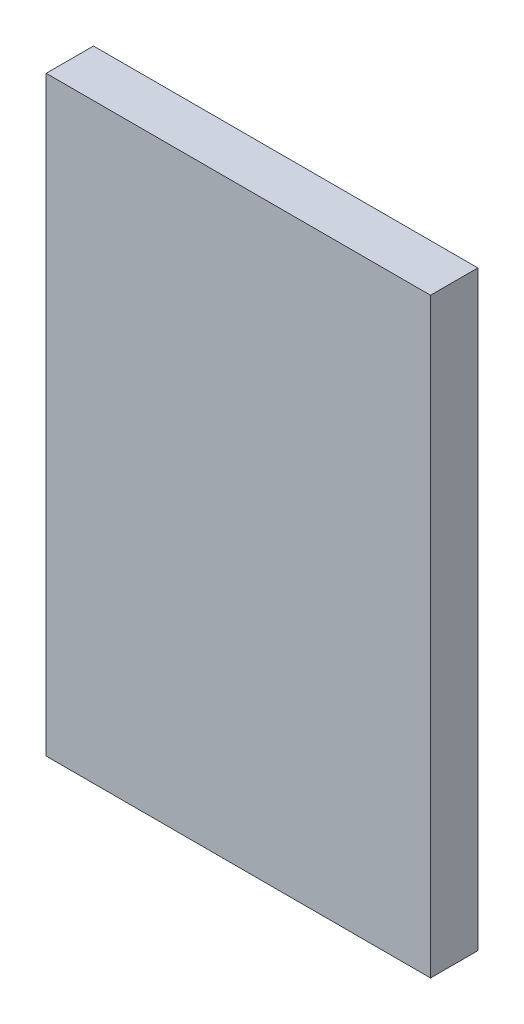
ISO-10303-21;
HEADER;
FILE_DESCRIPTION(('STEP AP214'),'2;1');
FILE_NAME('part.step','',(''),(''),'','','');
FILE_SCHEMA(('AUTOMOTIVE_DESIGN { 1 0 10303 214 1 1 1 1 }'));
ENDSEC;
DATA;
#1=APPLICATION_CONTEXT('core data for automotive mechanical design processes');
#2=APPLICATION_PROTOCOL_DEFINITION('international standard','automotive_design',2000,#1);
#3=PRODUCT_CONTEXT('',#1,'mechanical');
#4=PRODUCT('Part','Part','',(#3));
#5=PRODUCT_RELATED_PRODUCT_CATEGORY('part','',(#4));
#6=PRODUCT_DEFINITION_FORMATION('','',#4);
#7=PRODUCT_DEFINITION_CONTEXT('part definition',#1,'design');
#8=PRODUCT_DEFINITION('design','',#6,#7);
#9=PRODUCT_DEFINITION_SHAPE('','',#8);
#10=(LENGTH_UNIT() NAMED_UNIT(*) SI_UNIT(.MILLI.,.METRE.));
#11=(NAMED_UNIT(*) PLANE_ANGLE_UNIT() SI_UNIT($,.RADIAN.));
#12=(NAMED_UNIT(*) SI_UNIT($,.STERADIAN.) SOLID_ANGLE_UNIT());
#13=UNCERTAINTY_MEASURE_WITH_UNIT(LENGTH_MEASURE(1.E-05),#10,'distance_accuracy_value','');
#14=(GEOMETRIC_REPRESENTATION_CONTEXT(3) GLOBAL_UNCERTAINTY_ASSIGNED_CONTEXT((#13)) GLOBAL_UNIT_ASSIGNED_CONTEXT((#10,
#11,#12)) REPRESENTATION_CONTEXT('',''));
#15=CARTESIAN_POINT('',(0.,0.,0.));
#16=DIRECTION('',(0.,0.,1.));
#17=DIRECTION('',(1.,0.,0.));
#18=AXIS2_PLACEMENT_3D('',#15,#16,#17);
#19=CARTESIAN_POINT('',(0.,0.,-8.));
#20=DIRECTION('',(0.,-1.,0.));
#21=DIRECTION('',(0.,0.,-1.));
#22=AXIS2_PLACEMENT_3D('',#19,#20,#21);
#23=PLANE('',#22);
#24=DIRECTION('',(1.,0.,0.));
#25=VECTOR('',#24,1.);
#26=CARTESIAN_POINT('',(0.,0.,0.));
#27=LINE('',#26,#25);
#28=CARTESIAN_POINT('',(0.,0.,0.));
#29=VERTEX_POINT('',#28);
#30=CARTESIAN_POINT('',(65.,0.,0.));
#31=VERTEX_POINT('',#30);
#32=EDGE_CURVE('E100',#29,#31,#27,.T.);
#33=ORIENTED_EDGE('',*,*,#32,.F.);
#34=DIRECTION('',(0.,0.,1.));
#35=VECTOR('',#34,1.);
#36=CARTESIAN_POINT('',(0.,0.,-8.));
#37=LINE('',#36,#35);
#38=CARTESIAN_POINT('',(0.,0.,-8.));
#39=VERTEX_POINT('',#38);
#40=EDGE_CURVE('E11',#39,#29,#37,.T.);
#41=ORIENTED_EDGE('',*,*,#40,.F.);
#42=DIRECTION('',(1.,0.,0.));
#43=VECTOR('',#42,1.);
#44=CARTESIAN_POINT('',(0.,0.,-8.));
#45=LINE('',#44,#43);
#46=CARTESIAN_POINT('',(65.,0.,-8.));
#47=VERTEX_POINT('',#46);
#48=EDGE_CURVE('E94',#39,#47,#45,.T.);
#49=ORIENTED_EDGE('',*,*,#48,.T.);
#50=DIRECTION('',(0.,0.,1.));
#51=VECTOR('',#50,1.);
#52=CARTESIAN_POINT('',(65.,0.,-8.));
#53=LINE('',#52,#51);
#54=EDGE_CURVE('E39',#47,#31,#53,.T.);
#55=ORIENTED_EDGE('',*,*,#54,.T.);
#56=EDGE_LOOP('',(#33,#41,#49,#55));
#57=FACE_BOUND('',#56,.T.);
#58=ADVANCED_FACE('F36',(#57),#23,.T.);
#59=CARTESIAN_POINT('',(0.,0.,-8.));
#60=DIRECTION('',(-1.,0.,0.));
#61=DIRECTION('',(0.,0.,1.));
#62=AXIS2_PLACEMENT_3D('',#59,#60,#61);
#63=PLANE('',#62);
#64=DIRECTION('',(0.,-1.,0.));
#65=VECTOR('',#64,1.);
#66=CARTESIAN_POINT('',(0.,0.,0.));
#67=LINE('',#66,#65);
#68=CARTESIAN_POINT('',(0.,100.,0.));
#69=VERTEX_POINT('',#68);
#70=EDGE_CURVE('E96',#69,#29,#67,.T.);
#71=ORIENTED_EDGE('',*,*,#70,.F.);
#72=DIRECTION('',(0.,0.,1.));
#73=VECTOR('',#72,1.);
#74=CARTESIAN_POINT('',(0.,100.,-8.));
#75=LINE('',#74,#73);
#76=CARTESIAN_POINT('',(0.,100.,-8.));
#77=VERTEX_POINT('',#76);
#78=EDGE_CURVE('E45',#77,#69,#75,.T.);
#79=ORIENTED_EDGE('',*,*,#78,.F.);
#80=DIRECTION('',(0.,-1.,0.));
#81=VECTOR('',#80,1.);
#82=CARTESIAN_POINT('',(0.,0.,-8.));
#83=LINE('',#82,#81);
#84=EDGE_CURVE('E91',#77,#39,#83,.T.);
#85=ORIENTED_EDGE('',*,*,#84,.T.);
#86=ORIENTED_EDGE('',*,*,#40,.T.);
#87=EDGE_LOOP('',(#71,#79,#85,#86));
#88=FACE_BOUND('',#87,.T.);
#89=ADVANCED_FACE('F110',(#88),#63,.T.);
#90=CARTESIAN_POINT('',(0.,100.,-8.));
#91=DIRECTION('',(0.,1.,0.));
#92=DIRECTION('',(0.,0.,1.));
#93=AXIS2_PLACEMENT_3D('',#90,#91,#92);
#94=PLANE('',#93);
#95=DIRECTION('',(-1.,0.,0.));
#96=VECTOR('',#95,1.);
#97=CARTESIAN_POINT('',(0.,100.,0.));
#98=LINE('',#97,#96);
#99=CARTESIAN_POINT('',(65.,100.,0.));
#100=VERTEX_POINT('',#99);
#101=EDGE_CURVE('E86',#100,#69,#98,.T.);
#102=ORIENTED_EDGE('',*,*,#101,.F.);
#103=DIRECTION('',(0.,0.,1.));
#104=VECTOR('',#103,1.);
#105=CARTESIAN_POINT('',(65.,100.,-8.));
#106=LINE('',#105,#104);
#107=CARTESIAN_POINT('',(65.,100.,-8.));
#108=VERTEX_POINT('',#107);
#109=EDGE_CURVE('E81',#108,#100,#106,.T.);
#110=ORIENTED_EDGE('',*,*,#109,.F.);
#111=DIRECTION('',(-1.,0.,0.));
#112=VECTOR('',#111,1.);
#113=CARTESIAN_POINT('',(0.,100.,-8.));
#114=LINE('',#113,#112);
#115=EDGE_CURVE('E84',#108,#77,#114,.T.);
#116=ORIENTED_EDGE('',*,*,#115,.T.);
#117=ORIENTED_EDGE('',*,*,#78,.T.);
#118=EDGE_LOOP('',(#102,#110,#116,#117));
#119=FACE_BOUND('',#118,.T.);
#120=ADVANCED_FACE('F83',(#119),#94,.T.);
#121=CARTESIAN_POINT('',(65.,0.,-8.));
#122=DIRECTION('',(1.,0.,0.));
#123=DIRECTION('',(0.,0.,-1.));
#124=AXIS2_PLACEMENT_3D('',#121,#122,#123);
#125=PLANE('',#124);
#126=DIRECTION('',(0.,1.,0.));
#127=VECTOR('',#126,1.);
#128=CARTESIAN_POINT('',(65.,0.,0.));
#129=LINE('',#128,#127);
#130=EDGE_CURVE('E103',#31,#100,#129,.T.);
#131=ORIENTED_EDGE('',*,*,#130,.F.);
#132=ORIENTED_EDGE('',*,*,#54,.F.);
#133=DIRECTION('',(0.,1.,0.));
#134=VECTOR('',#133,1.);
#135=CARTESIAN_POINT('',(65.,0.,-8.));
#136=LINE('',#135,#134);
#137=EDGE_CURVE('E90',#47,#108,#136,.T.);
#138=ORIENTED_EDGE('',*,*,#137,.T.);
#139=ORIENTED_EDGE('',*,*,#109,.T.);
#140=EDGE_LOOP('',(#131,#132,#138,#139));
#141=FACE_BOUND('',#140,.T.);
#142=ADVANCED_FACE('F93',(#141),#125,.T.);
#143=CARTESIAN_POINT('',(0.,0.,-8.));
#144=DIRECTION('',(0.,0.,1.));
#145=DIRECTION('',(1.,0.,0.));
#146=AXIS2_PLACEMENT_3D('',#143,#144,#145);
#147=PLANE('',#146);
#148=ORIENTED_EDGE('',*,*,#48,.F.);
#149=ORIENTED_EDGE('',*,*,#84,.F.);
#150=ORIENTED_EDGE('',*,*,#115,.F.);
#151=ORIENTED_EDGE('',*,*,#137,.F.);
#152=EDGE_LOOP('',(#148,#149,#150,#151));
#153=FACE_BOUND('',#152,.T.);
#154=ADVANCED_FACE('F89',(#153),#147,.F.);
#155=CARTESIAN_POINT('',(0.,0.,0.));
#156=DIRECTION('',(0.,0.,1.));
#157=DIRECTION('',(1.,0.,0.));
#158=AXIS2_PLACEMENT_3D('',#155,#156,#157);
#159=PLANE('',#158);
#160=ORIENTED_EDGE('',*,*,#32,.T.);
#161=ORIENTED_EDGE('',*,*,#130,.T.);
#162=ORIENTED_EDGE('',*,*,#101,.T.);
#163=ORIENTED_EDGE('',*,*,#70,.T.);
#164=EDGE_LOOP('',(#160,#161,#162,#163));
#165=FACE_BOUND('',#164,.T.);
#166=ADVANCED_FACE('F109',(#165),#159,.T.);
#167=CLOSED_SHELL('',(#58,#89,#120,#142,#154,#166));
#168=MANIFOLD_SOLID_BREP('B2',#167);
#169=ADVANCED_BREP_SHAPE_REPRESENTATION('',(#18,#168),#14);
#170=SHAPE_DEFINITION_REPRESENTATION(#9,#169);
ENDSEC;
END-ISO-10303-21;
